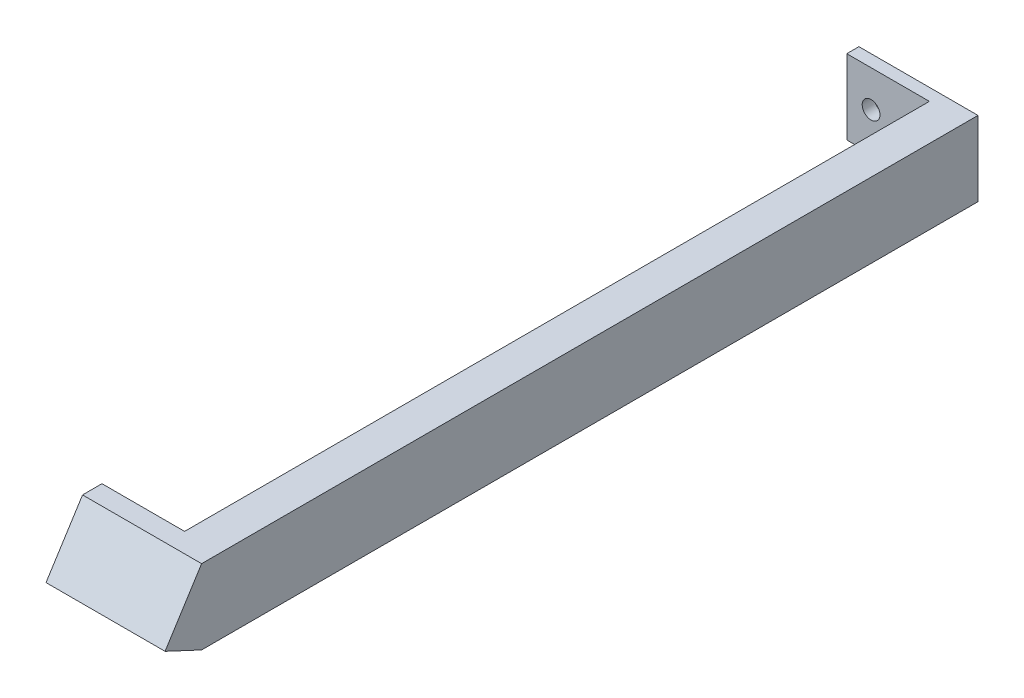
ISO-10303-21;
HEADER;
FILE_DESCRIPTION(('STEP AP214'),'2;1');
FILE_NAME('part.step','',(''),(''),'','','');
FILE_SCHEMA(('AUTOMOTIVE_DESIGN { 1 0 10303 214 1 1 1 1 }'));
ENDSEC;
DATA;
#1=APPLICATION_CONTEXT('core data for automotive mechanical design processes');
#2=APPLICATION_PROTOCOL_DEFINITION('international standard','automotive_design',2000,#1);
#3=PRODUCT_CONTEXT('',#1,'mechanical');
#4=PRODUCT('Part','Part','',(#3));
#5=PRODUCT_RELATED_PRODUCT_CATEGORY('part','',(#4));
#6=PRODUCT_DEFINITION_FORMATION('','',#4);
#7=PRODUCT_DEFINITION_CONTEXT('part definition',#1,'design');
#8=PRODUCT_DEFINITION('design','',#6,#7);
#9=PRODUCT_DEFINITION_SHAPE('','',#8);
#10=(LENGTH_UNIT() NAMED_UNIT(*) SI_UNIT(.MILLI.,.METRE.));
#11=(NAMED_UNIT(*) PLANE_ANGLE_UNIT() SI_UNIT($,.RADIAN.));
#12=(NAMED_UNIT(*) SI_UNIT($,.STERADIAN.) SOLID_ANGLE_UNIT());
#13=UNCERTAINTY_MEASURE_WITH_UNIT(LENGTH_MEASURE(1.E-05),#10,'distance_accuracy_value','');
#14=(GEOMETRIC_REPRESENTATION_CONTEXT(3) GLOBAL_UNCERTAINTY_ASSIGNED_CONTEXT((#13)) GLOBAL_UNIT_ASSIGNED_CONTEXT((#10,
#11,#12)) REPRESENTATION_CONTEXT('',''));
#15=CARTESIAN_POINT('',(0.,0.,0.));
#16=DIRECTION('',(0.,0.,1.));
#17=DIRECTION('',(1.,0.,0.));
#18=AXIS2_PLACEMENT_3D('',#15,#16,#17);
#19=CARTESIAN_POINT('',(0.,0.,0.));
#20=DIRECTION('',(-1.,0.,0.));
#21=DIRECTION('',(0.,0.,1.));
#22=AXIS2_PLACEMENT_3D('',#19,#20,#21);
#23=PLANE('',#22);
#24=DIRECTION('',(0.,-1.,0.));
#25=VECTOR('',#24,1.);
#26=CARTESIAN_POINT('',(0.,-30.9636071324348,61.37426674366));
#27=LINE('',#26,#25);
#28=CARTESIAN_POINT('',(0.,-0.209706311579794,61.37426674366));
#29=VERTEX_POINT('',#28);
#30=CARTESIAN_POINT('',(0.,-30.9636071324348,61.37426674366));
#31=VERTEX_POINT('',#30);
#32=EDGE_CURVE('E194',#29,#31,#27,.T.);
#33=ORIENTED_EDGE('',*,*,#32,.F.);
#34=DIRECTION('',(0.,0.,1.));
#35=VECTOR('',#34,1.);
#36=CARTESIAN_POINT('',(0.,-0.209706311579794,56.37426674366));
#37=LINE('',#36,#35);
#38=CARTESIAN_POINT('',(0.,-0.209706311579794,56.37426674366));
#39=VERTEX_POINT('',#38);
#40=EDGE_CURVE('E143',#39,#29,#37,.T.);
#41=ORIENTED_EDGE('',*,*,#40,.F.);
#42=DIRECTION('',(0.,1.,0.));
#43=VECTOR('',#42,1.);
#44=CARTESIAN_POINT('',(0.,-0.209706311579794,56.37426674366));
#45=LINE('',#44,#43);
#46=CARTESIAN_POINT('',(0.,-30.9636071324348,56.37426674366));
#47=VERTEX_POINT('',#46);
#48=EDGE_CURVE('E137',#47,#39,#45,.T.);
#49=ORIENTED_EDGE('',*,*,#48,.F.);
#50=DIRECTION('',(0.,0.,-1.));
#51=VECTOR('',#50,1.);
#52=CARTESIAN_POINT('',(0.,-30.9636071324348,56.37426674366));
#53=LINE('',#52,#51);
#54=EDGE_CURVE('E93',#31,#47,#53,.T.);
#55=ORIENTED_EDGE('',*,*,#54,.F.);
#56=EDGE_LOOP('',(#33,#41,#49,#55));
#57=FACE_BOUND('',#56,.T.);
#58=ADVANCED_FACE('F43',(#57),#23,.T.);
#59=CARTESIAN_POINT('',(49.,-0.209706311579794,56.37426674366));
#60=DIRECTION('',(0.,0.,1.));
#61=DIRECTION('',(1.,0.,0.));
#62=AXIS2_PLACEMENT_3D('',#59,#60,#61);
#63=PLANE('',#62);
#64=CARTESIAN_POINT('',(10.,-15.2097063115798,56.37426674366));
#65=DIRECTION('',(0.,0.,-1.));
#66=DIRECTION('',(-1.,0.,0.));
#67=AXIS2_PLACEMENT_3D('',#64,#65,#66);
#68=CIRCLE('',#67,3.65);
#69=CARTESIAN_POINT('',(6.35,-15.2097063115798,56.37426674366));
#70=VERTEX_POINT('',#69);
#71=EDGE_CURVE('E212',#70,#70,#68,.T.);
#72=ORIENTED_EDGE('',*,*,#71,.F.);
#73=EDGE_LOOP('',(#72));
#74=FACE_BOUND('',#73,.T.);
#75=ORIENTED_EDGE('',*,*,#48,.T.);
#76=DIRECTION('',(-1.,0.,0.));
#77=VECTOR('',#76,1.);
#78=CARTESIAN_POINT('',(49.,-0.209706311579794,56.37426674366));
#79=LINE('',#78,#77);
#80=CARTESIAN_POINT('',(49.,-0.209706311579794,56.37426674366));
#81=VERTEX_POINT('',#80);
#82=EDGE_CURVE('E11',#81,#39,#79,.T.);
#83=ORIENTED_EDGE('',*,*,#82,.F.);
#84=DIRECTION('',(0.,1.,0.));
#85=VECTOR('',#84,1.);
#86=CARTESIAN_POINT('',(49.,-0.209706311579794,56.37426674366));
#87=LINE('',#86,#85);
#88=CARTESIAN_POINT('',(49.,-30.9636071324348,56.37426674366));
#89=VERTEX_POINT('',#88);
#90=EDGE_CURVE('E156',#89,#81,#87,.T.);
#91=ORIENTED_EDGE('',*,*,#90,.F.);
#92=DIRECTION('',(-1.,0.,0.));
#93=VECTOR('',#92,1.);
#94=CARTESIAN_POINT('',(49.,-30.9636071324348,56.37426674366));
#95=LINE('',#94,#93);
#96=EDGE_CURVE('E133',#89,#47,#95,.T.);
#97=ORIENTED_EDGE('',*,*,#96,.T.);
#98=EDGE_LOOP('',(#75,#83,#91,#97));
#99=FACE_BOUND('',#98,.T.);
#100=ADVANCED_FACE('F45',(#74,#99),#63,.F.);
#101=CARTESIAN_POINT('',(49.,-0.209706311579794,56.37426674366));
#102=DIRECTION('',(0.,-1.,0.));
#103=DIRECTION('',(0.,0.,-1.));
#104=AXIS2_PLACEMENT_3D('',#101,#102,#103);
#105=PLANE('',#104);
#106=ORIENTED_EDGE('',*,*,#40,.T.);
#107=DIRECTION('',(-1.,0.,0.));
#108=VECTOR('',#107,1.);
#109=CARTESIAN_POINT('',(34.,-0.209706311579794,61.37426674366));
#110=LINE('',#109,#108);
#111=CARTESIAN_POINT('',(34.,-0.209706311579794,61.37426674366));
#112=VERTEX_POINT('',#111);
#113=EDGE_CURVE('E142',#112,#29,#110,.T.);
#114=ORIENTED_EDGE('',*,*,#113,.F.);
#115=DIRECTION('',(0.,0.,-1.));
#116=VECTOR('',#115,1.);
#117=CARTESIAN_POINT('',(34.,-0.209706311579794,61.37426674366));
#118=LINE('',#117,#116);
#119=CARTESIAN_POINT('',(34.,-0.209706311579794,367.846564769745));
#120=VERTEX_POINT('',#119);
#121=EDGE_CURVE('E180',#120,#112,#118,.T.);
#122=ORIENTED_EDGE('',*,*,#121,.F.);
#123=DIRECTION('',(-1.,0.,0.));
#124=VECTOR('',#123,1.);
#125=CARTESIAN_POINT('',(34.,-0.209706311579794,367.846564769745));
#126=LINE('',#125,#124);
#127=CARTESIAN_POINT('',(0.,-0.209706311579794,367.846564769745));
#128=VERTEX_POINT('',#127);
#129=EDGE_CURVE('E183',#120,#128,#126,.T.);
#130=ORIENTED_EDGE('',*,*,#129,.T.);
#131=CARTESIAN_POINT('',(0.,-0.209706311579794,375.846564769745));
#132=VERTEX_POINT('',#131);
#133=EDGE_CURVE('E141',#128,#132,#37,.T.);
#134=ORIENTED_EDGE('',*,*,#133,.T.);
#135=DIRECTION('',(-1.,0.,0.));
#136=VECTOR('',#135,1.);
#137=CARTESIAN_POINT('',(49.,-0.209706311579794,375.846564769745));
#138=LINE('',#137,#136);
#139=CARTESIAN_POINT('',(49.,-0.209706311579794,375.846564769745));
#140=VERTEX_POINT('',#139);
#141=EDGE_CURVE('E53',#140,#132,#138,.T.);
#142=ORIENTED_EDGE('',*,*,#141,.F.);
#143=DIRECTION('',(0.,0.,1.));
#144=VECTOR('',#143,1.);
#145=CARTESIAN_POINT('',(49.,-0.209706311579794,56.37426674366));
#146=LINE('',#145,#144);
#147=EDGE_CURVE('E101',#81,#140,#146,.T.);
#148=ORIENTED_EDGE('',*,*,#147,.F.);
#149=ORIENTED_EDGE('',*,*,#82,.T.);
#150=EDGE_LOOP('',(#106,#114,#122,#130,#134,#142,#148,#149));
#151=FACE_BOUND('',#150,.T.);
#152=ADVANCED_FACE('F240',(#151),#105,.F.);
#153=CARTESIAN_POINT('',(49.,-0.209706311579794,375.846564769745));
#154=DIRECTION('',(0.,-0.534954632370406,-0.844880785262302));
#155=DIRECTION('',(0.,0.844880785262302,-0.534954632370406));
#156=AXIS2_PLACEMENT_3D('',#153,#154,#155);
#157=PLANE('',#156);
#158=DIRECTION('',(0.,-0.844880785262302,0.534954632370406));
#159=VECTOR('',#158,1.);
#160=CARTESIAN_POINT('',(0.,-0.209706311579794,375.846564769745));
#161=LINE('',#160,#159);
#162=CARTESIAN_POINT('',(0.,-23.9455010741949,390.875399112701));
#163=VERTEX_POINT('',#162);
#164=EDGE_CURVE('E122',#132,#163,#161,.T.);
#165=ORIENTED_EDGE('',*,*,#164,.T.);
#166=DIRECTION('',(-1.,0.,0.));
#167=VECTOR('',#166,1.);
#168=CARTESIAN_POINT('',(49.,-23.9455010741949,390.875399112701));
#169=LINE('',#168,#167);
#170=CARTESIAN_POINT('',(49.,-23.9455010741949,390.875399112701));
#171=VERTEX_POINT('',#170);
#172=EDGE_CURVE('E119',#171,#163,#169,.T.);
#173=ORIENTED_EDGE('',*,*,#172,.F.);
#174=DIRECTION('',(0.,-0.844880785262302,0.534954632370406));
#175=VECTOR('',#174,1.);
#176=CARTESIAN_POINT('',(49.,-0.209706311579794,375.846564769745));
#177=LINE('',#176,#175);
#178=EDGE_CURVE('E108',#140,#171,#177,.T.);
#179=ORIENTED_EDGE('',*,*,#178,.F.);
#180=ORIENTED_EDGE('',*,*,#141,.T.);
#181=EDGE_LOOP('',(#165,#173,#179,#180));
#182=FACE_BOUND('',#181,.T.);
#183=ADVANCED_FACE('F120',(#182),#157,.F.);
#184=CARTESIAN_POINT('',(49.,-23.9455010741949,390.875399112701));
#185=DIRECTION('',(0.,0.906075678716478,-0.423115663192081));
#186=DIRECTION('',(0.,0.423115663192081,0.906075678716478));
#187=AXIS2_PLACEMENT_3D('',#184,#185,#186);
#188=PLANE('',#187);
#189=DIRECTION('',(0.,-0.423115663192081,-0.906075678716478));
#190=VECTOR('',#189,1.);
#191=CARTESIAN_POINT('',(0.,-23.9455010741949,390.875399112701));
#192=LINE('',#191,#190);
#193=CARTESIAN_POINT('',(0.,-30.9636071324348,375.846564769745));
#194=VERTEX_POINT('',#193);
#195=EDGE_CURVE('E149',#163,#194,#192,.T.);
#196=ORIENTED_EDGE('',*,*,#195,.T.);
#197=DIRECTION('',(-1.,0.,0.));
#198=VECTOR('',#197,1.);
#199=CARTESIAN_POINT('',(49.,-30.9636071324348,375.846564769745));
#200=LINE('',#199,#198);
#201=CARTESIAN_POINT('',(49.,-30.9636071324348,375.846564769745));
#202=VERTEX_POINT('',#201);
#203=EDGE_CURVE('E126',#202,#194,#200,.T.);
#204=ORIENTED_EDGE('',*,*,#203,.F.);
#205=DIRECTION('',(0.,-0.423115663192081,-0.906075678716478));
#206=VECTOR('',#205,1.);
#207=CARTESIAN_POINT('',(49.,-23.9455010741949,390.875399112701));
#208=LINE('',#207,#206);
#209=EDGE_CURVE('E112',#171,#202,#208,.T.);
#210=ORIENTED_EDGE('',*,*,#209,.F.);
#211=ORIENTED_EDGE('',*,*,#172,.T.);
#212=EDGE_LOOP('',(#196,#204,#210,#211));
#213=FACE_BOUND('',#212,.T.);
#214=ADVANCED_FACE('F128',(#213),#188,.F.);
#215=CARTESIAN_POINT('',(49.,-30.9636071324348,56.37426674366));
#216=DIRECTION('',(0.,1.,0.));
#217=DIRECTION('',(0.,0.,1.));
#218=AXIS2_PLACEMENT_3D('',#215,#216,#217);
#219=PLANE('',#218);
#220=DIRECTION('',(0.,0.,1.));
#221=VECTOR('',#220,1.);
#222=CARTESIAN_POINT('',(34.,-30.9636071324348,61.37426674366));
#223=LINE('',#222,#221);
#224=CARTESIAN_POINT('',(34.,-30.9636071324348,61.37426674366));
#225=VERTEX_POINT('',#224);
#226=CARTESIAN_POINT('',(34.,-30.9636071324348,367.846564769745));
#227=VERTEX_POINT('',#226);
#228=EDGE_CURVE('E205',#225,#227,#223,.T.);
#229=ORIENTED_EDGE('',*,*,#228,.F.);
#230=DIRECTION('',(-1.,0.,0.));
#231=VECTOR('',#230,1.);
#232=CARTESIAN_POINT('',(34.,-30.9636071324348,61.37426674366));
#233=LINE('',#232,#231);
#234=EDGE_CURVE('E177',#225,#31,#233,.T.);
#235=ORIENTED_EDGE('',*,*,#234,.T.);
#236=ORIENTED_EDGE('',*,*,#54,.T.);
#237=ORIENTED_EDGE('',*,*,#96,.F.);
#238=DIRECTION('',(0.,0.,-1.));
#239=VECTOR('',#238,1.);
#240=CARTESIAN_POINT('',(49.,-30.9636071324348,56.37426674366));
#241=LINE('',#240,#239);
#242=EDGE_CURVE('E69',#202,#89,#241,.T.);
#243=ORIENTED_EDGE('',*,*,#242,.F.);
#244=ORIENTED_EDGE('',*,*,#203,.T.);
#245=CARTESIAN_POINT('',(0.,-30.9636071324348,367.846564769745));
#246=VERTEX_POINT('',#245);
#247=EDGE_CURVE('E152',#194,#246,#53,.T.);
#248=ORIENTED_EDGE('',*,*,#247,.T.);
#249=DIRECTION('',(-1.,0.,0.));
#250=VECTOR('',#249,1.);
#251=CARTESIAN_POINT('',(34.,-30.9636071324348,367.846564769745));
#252=LINE('',#251,#250);
#253=EDGE_CURVE('E60',#227,#246,#252,.T.);
#254=ORIENTED_EDGE('',*,*,#253,.F.);
#255=EDGE_LOOP('',(#229,#235,#236,#237,#243,#244,#248,#254));
#256=FACE_BOUND('',#255,.T.);
#257=ADVANCED_FACE('F168',(#256),#219,.F.);
#258=CARTESIAN_POINT('',(49.,0.,0.));
#259=DIRECTION('',(-1.,0.,0.));
#260=DIRECTION('',(0.,0.,1.));
#261=AXIS2_PLACEMENT_3D('',#258,#259,#260);
#262=PLANE('',#261);
#263=ORIENTED_EDGE('',*,*,#90,.T.);
#264=ORIENTED_EDGE('',*,*,#147,.T.);
#265=ORIENTED_EDGE('',*,*,#178,.T.);
#266=ORIENTED_EDGE('',*,*,#209,.T.);
#267=ORIENTED_EDGE('',*,*,#242,.T.);
#268=EDGE_LOOP('',(#263,#264,#265,#266,#267));
#269=FACE_BOUND('',#268,.T.);
#270=ADVANCED_FACE('F110',(#269),#262,.F.);
#271=DIRECTION('',(0.,1.,0.));
#272=VECTOR('',#271,1.);
#273=CARTESIAN_POINT('',(0.,-30.9636071324348,367.846564769745));
#274=LINE('',#273,#272);
#275=EDGE_CURVE('E190',#246,#128,#274,.T.);
#276=ORIENTED_EDGE('',*,*,#275,.F.);
#277=ORIENTED_EDGE('',*,*,#247,.F.);
#278=ORIENTED_EDGE('',*,*,#195,.F.);
#279=ORIENTED_EDGE('',*,*,#164,.F.);
#280=ORIENTED_EDGE('',*,*,#133,.F.);
#281=EDGE_LOOP('',(#276,#277,#278,#279,#280));
#282=FACE_BOUND('',#281,.T.);
#283=ADVANCED_FACE('F164',(#282),#23,.T.);
#284=CARTESIAN_POINT('',(34.,-30.9636071324348,61.37426674366));
#285=DIRECTION('',(0.,0.,-1.));
#286=DIRECTION('',(0.,1.,0.));
#287=AXIS2_PLACEMENT_3D('',#284,#285,#286);
#288=PLANE('',#287);
#289=CARTESIAN_POINT('',(10.,-15.2097063115798,61.37426674366));
#290=DIRECTION('',(0.,0.,-1.));
#291=DIRECTION('',(0.,1.,0.));
#292=AXIS2_PLACEMENT_3D('',#289,#290,#291);
#293=CIRCLE('',#292,3.65);
#294=CARTESIAN_POINT('',(10.,-11.5597063115798,61.37426674366));
#295=VERTEX_POINT('',#294);
#296=EDGE_CURVE('E47',#295,#295,#293,.T.);
#297=ORIENTED_EDGE('',*,*,#296,.T.);
#298=EDGE_LOOP('',(#297));
#299=FACE_BOUND('',#298,.T.);
#300=ORIENTED_EDGE('',*,*,#32,.T.);
#301=ORIENTED_EDGE('',*,*,#234,.F.);
#302=DIRECTION('',(0.,-1.,0.));
#303=VECTOR('',#302,1.);
#304=CARTESIAN_POINT('',(34.,-30.9636071324348,61.37426674366));
#305=LINE('',#304,#303);
#306=EDGE_CURVE('E193',#112,#225,#305,.T.);
#307=ORIENTED_EDGE('',*,*,#306,.F.);
#308=ORIENTED_EDGE('',*,*,#113,.T.);
#309=EDGE_LOOP('',(#300,#301,#307,#308));
#310=FACE_BOUND('',#309,.T.);
#311=ADVANCED_FACE('F221',(#299,#310),#288,.F.);
#312=CARTESIAN_POINT('',(34.,-30.9636071324348,367.846564769745));
#313=DIRECTION('',(0.,0.,1.));
#314=DIRECTION('',(1.,0.,0.));
#315=AXIS2_PLACEMENT_3D('',#312,#313,#314);
#316=PLANE('',#315);
#317=ORIENTED_EDGE('',*,*,#275,.T.);
#318=ORIENTED_EDGE('',*,*,#129,.F.);
#319=DIRECTION('',(0.,1.,0.));
#320=VECTOR('',#319,1.);
#321=CARTESIAN_POINT('',(34.,-30.9636071324348,367.846564769745));
#322=LINE('',#321,#320);
#323=EDGE_CURVE('E201',#227,#120,#322,.T.);
#324=ORIENTED_EDGE('',*,*,#323,.F.);
#325=ORIENTED_EDGE('',*,*,#253,.T.);
#326=EDGE_LOOP('',(#317,#318,#324,#325));
#327=FACE_BOUND('',#326,.T.);
#328=ADVANCED_FACE('F231',(#327),#316,.F.);
#329=CARTESIAN_POINT('',(34.,0.,0.));
#330=DIRECTION('',(1.,0.,0.));
#331=DIRECTION('',(0.,0.,-1.));
#332=AXIS2_PLACEMENT_3D('',#329,#330,#331);
#333=PLANE('',#332);
#334=ORIENTED_EDGE('',*,*,#306,.T.);
#335=ORIENTED_EDGE('',*,*,#228,.T.);
#336=ORIENTED_EDGE('',*,*,#323,.T.);
#337=ORIENTED_EDGE('',*,*,#121,.T.);
#338=EDGE_LOOP('',(#334,#335,#336,#337));
#339=FACE_BOUND('',#338,.T.);
#340=ADVANCED_FACE('F226',(#339),#333,.F.);
#341=CARTESIAN_POINT('',(10.,-15.2097063115798,66.37426674366));
#342=DIRECTION('',(0.,0.,-1.));
#343=DIRECTION('',(-1.,0.,0.));
#344=AXIS2_PLACEMENT_3D('',#341,#342,#343);
#345=CYLINDRICAL_SURFACE('',#344,3.65);
#346=ORIENTED_EDGE('',*,*,#71,.T.);
#347=EDGE_LOOP('',(#346));
#348=FACE_BOUND('',#347,.T.);
#349=ORIENTED_EDGE('',*,*,#296,.F.);
#350=EDGE_LOOP('',(#349));
#351=FACE_BOUND('',#350,.T.);
#352=ADVANCED_FACE('F224',(#348,#351),#345,.F.);
#353=CLOSED_SHELL('',(#58,#100,#152,#183,#214,#257,#270,#283,#311,#328,#340,#352));
#354=MANIFOLD_SOLID_BREP('B2',#353);
#355=ADVANCED_BREP_SHAPE_REPRESENTATION('',(#18,#354),#14);
#356=SHAPE_DEFINITION_REPRESENTATION(#9,#355);
ENDSEC;
END-ISO-10303-21;
